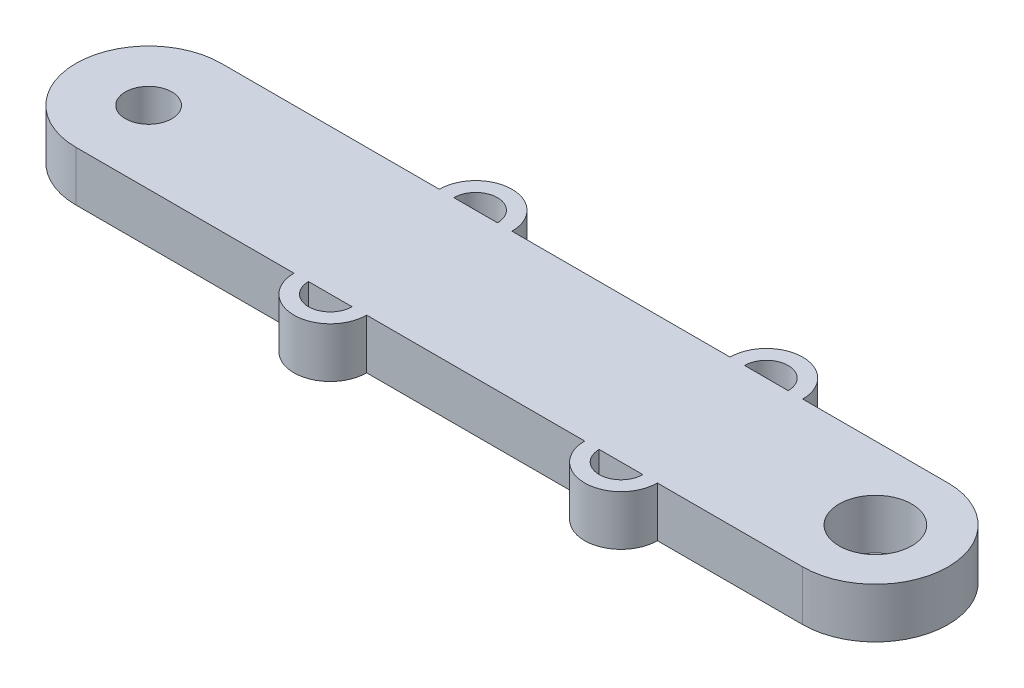
ISO-10303-21;
HEADER;
FILE_DESCRIPTION(('STEP AP214'),'2;1');
FILE_NAME('part.step','',(''),(''),'','','');
FILE_SCHEMA(('AUTOMOTIVE_DESIGN { 1 0 10303 214 1 1 1 1 }'));
ENDSEC;
DATA;
#1=APPLICATION_CONTEXT('core data for automotive mechanical design processes');
#2=APPLICATION_PROTOCOL_DEFINITION('international standard','automotive_design',2000,#1);
#3=PRODUCT_CONTEXT('',#1,'mechanical');
#4=PRODUCT('Part','Part','',(#3));
#5=PRODUCT_RELATED_PRODUCT_CATEGORY('part','',(#4));
#6=PRODUCT_DEFINITION_FORMATION('','',#4);
#7=PRODUCT_DEFINITION_CONTEXT('part definition',#1,'design');
#8=PRODUCT_DEFINITION('design','',#6,#7);
#9=PRODUCT_DEFINITION_SHAPE('','',#8);
#10=(LENGTH_UNIT() NAMED_UNIT(*) SI_UNIT(.MILLI.,.METRE.));
#11=(NAMED_UNIT(*) PLANE_ANGLE_UNIT() SI_UNIT($,.RADIAN.));
#12=(NAMED_UNIT(*) SI_UNIT($,.STERADIAN.) SOLID_ANGLE_UNIT());
#13=UNCERTAINTY_MEASURE_WITH_UNIT(LENGTH_MEASURE(1.E-05),#10,'distance_accuracy_value','');
#14=(GEOMETRIC_REPRESENTATION_CONTEXT(3) GLOBAL_UNCERTAINTY_ASSIGNED_CONTEXT((#13)) GLOBAL_UNIT_ASSIGNED_CONTEXT((#10,
#11,#12)) REPRESENTATION_CONTEXT('',''));
#15=CARTESIAN_POINT('',(0.,0.,0.));
#16=DIRECTION('',(0.,0.,1.));
#17=DIRECTION('',(1.,0.,0.));
#18=AXIS2_PLACEMENT_3D('',#15,#16,#17);
#19=CARTESIAN_POINT('',(0.,6.88,-10.));
#20=DIRECTION('',(0.,0.,-1.));
#21=DIRECTION('',(-1.,0.,0.));
#22=AXIS2_PLACEMENT_3D('',#19,#20,#21);
#23=PLANE('',#22);
#24=DIRECTION('',(1.,0.,0.));
#25=VECTOR('',#24,1.);
#26=CARTESIAN_POINT('',(0.,6.88,-10.));
#27=LINE('',#26,#25);
#28=CARTESIAN_POINT('',(22.,6.88,-10.));
#29=VERTEX_POINT('',#28);
#30=CARTESIAN_POINT('',(28.,6.88,-10.));
#31=VERTEX_POINT('',#30);
#32=EDGE_CURVE('E195',#29,#31,#27,.T.);
#33=ORIENTED_EDGE('',*,*,#32,.T.);
#34=DIRECTION('',(0.,-1.,0.));
#35=VECTOR('',#34,1.);
#36=CARTESIAN_POINT('',(28.,18.060339887499,-10.));
#37=LINE('',#36,#35);
#38=CARTESIAN_POINT('',(28.,0.,-10.));
#39=VERTEX_POINT('',#38);
#40=EDGE_CURVE('E188',#31,#39,#37,.T.);
#41=ORIENTED_EDGE('',*,*,#40,.T.);
#42=DIRECTION('',(1.,0.,0.));
#43=VECTOR('',#42,1.);
#44=CARTESIAN_POINT('',(0.,0.,-10.));
#45=LINE('',#44,#43);
#46=CARTESIAN_POINT('',(22.,0.,-10.));
#47=VERTEX_POINT('',#46);
#48=EDGE_CURVE('E432',#47,#39,#45,.T.);
#49=ORIENTED_EDGE('',*,*,#48,.F.);
#50=DIRECTION('',(0.,-1.,0.));
#51=VECTOR('',#50,1.);
#52=CARTESIAN_POINT('',(22.,18.060339887499,-10.));
#53=LINE('',#52,#51);
#54=EDGE_CURVE('E427',#29,#47,#53,.T.);
#55=ORIENTED_EDGE('',*,*,#54,.F.);
#56=EDGE_LOOP('',(#33,#41,#49,#55));
#57=FACE_BOUND('',#56,.T.);
#58=ADVANCED_FACE('F35',(#57),#23,.T.);
#59=DIRECTION('',(0.,-1.,0.));
#60=VECTOR('',#59,1.);
#61=CARTESIAN_POINT('',(30.,18.060339887499,-10.));
#62=LINE('',#61,#60);
#63=CARTESIAN_POINT('',(30.,6.88,-10.));
#64=VERTEX_POINT('',#63);
#65=CARTESIAN_POINT('',(30.,0.,-10.));
#66=VERTEX_POINT('',#65);
#67=EDGE_CURVE('E173',#64,#66,#62,.T.);
#68=ORIENTED_EDGE('',*,*,#67,.F.);
#69=CARTESIAN_POINT('',(50.,6.88,-10.));
#70=VERTEX_POINT('',#69);
#71=EDGE_CURVE('E185',#64,#70,#27,.T.);
#72=ORIENTED_EDGE('',*,*,#71,.T.);
#73=DIRECTION('',(0.,-1.,0.));
#74=VECTOR('',#73,1.);
#75=CARTESIAN_POINT('',(50.,6.88,-10.));
#76=LINE('',#75,#74);
#77=CARTESIAN_POINT('',(50.,0.,-10.));
#78=VERTEX_POINT('',#77);
#79=EDGE_CURVE('E209',#70,#78,#76,.T.);
#80=ORIENTED_EDGE('',*,*,#79,.T.);
#81=EDGE_CURVE('E187',#66,#78,#45,.T.);
#82=ORIENTED_EDGE('',*,*,#81,.F.);
#83=EDGE_LOOP('',(#68,#72,#80,#82));
#84=FACE_BOUND('',#83,.T.);
#85=ADVANCED_FACE('F183',(#84),#23,.T.);
#86=CARTESIAN_POINT('',(-18.,6.88,-9.99999999999999));
#87=VERTEX_POINT('',#86);
#88=CARTESIAN_POINT('',(-12.,6.88,-9.99999999999999));
#89=VERTEX_POINT('',#88);
#90=EDGE_CURVE('E205',#87,#89,#27,.T.);
#91=ORIENTED_EDGE('',*,*,#90,.T.);
#92=DIRECTION('',(0.,-1.,0.));
#93=VECTOR('',#92,1.);
#94=CARTESIAN_POINT('',(-12.,18.060339887499,-9.99999999999999));
#95=LINE('',#94,#93);
#96=CARTESIAN_POINT('',(-12.,0.,-9.99999999999999));
#97=VERTEX_POINT('',#96);
#98=EDGE_CURVE('E450',#89,#97,#95,.T.);
#99=ORIENTED_EDGE('',*,*,#98,.T.);
#100=CARTESIAN_POINT('',(-18.,0.,-10.));
#101=VERTEX_POINT('',#100);
#102=EDGE_CURVE('E330',#101,#97,#45,.T.);
#103=ORIENTED_EDGE('',*,*,#102,.F.);
#104=DIRECTION('',(0.,-1.,0.));
#105=VECTOR('',#104,1.);
#106=CARTESIAN_POINT('',(-18.,18.060339887499,-9.99999999999999));
#107=LINE('',#106,#105);
#108=EDGE_CURVE('E238',#87,#101,#107,.T.);
#109=ORIENTED_EDGE('',*,*,#108,.F.);
#110=EDGE_LOOP('',(#91,#99,#103,#109));
#111=FACE_BOUND('',#110,.T.);
#112=ADVANCED_FACE('F361',(#111),#23,.T.);
#113=DIRECTION('',(0.,-1.,0.));
#114=VECTOR('',#113,1.);
#115=CARTESIAN_POINT('',(20.,18.060339887499,-10.));
#116=LINE('',#115,#114);
#117=CARTESIAN_POINT('',(20.,6.88,-10.));
#118=VERTEX_POINT('',#117);
#119=CARTESIAN_POINT('',(20.,0.,-10.));
#120=VERTEX_POINT('',#119);
#121=EDGE_CURVE('E176',#118,#120,#116,.T.);
#122=ORIENTED_EDGE('',*,*,#121,.T.);
#123=CARTESIAN_POINT('',(-10.,0.,-10.));
#124=VERTEX_POINT('',#123);
#125=EDGE_CURVE('E460',#124,#120,#45,.T.);
#126=ORIENTED_EDGE('',*,*,#125,.F.);
#127=DIRECTION('',(0.,-1.,0.));
#128=VECTOR('',#127,1.);
#129=CARTESIAN_POINT('',(-10.,18.060339887499,-9.99999999999999));
#130=LINE('',#129,#128);
#131=CARTESIAN_POINT('',(-10.,6.88,-9.99999999999999));
#132=VERTEX_POINT('',#131);
#133=EDGE_CURVE('E221',#132,#124,#130,.T.);
#134=ORIENTED_EDGE('',*,*,#133,.F.);
#135=EDGE_CURVE('E199',#132,#118,#27,.T.);
#136=ORIENTED_EDGE('',*,*,#135,.T.);
#137=EDGE_LOOP('',(#122,#126,#134,#136));
#138=FACE_BOUND('',#137,.T.);
#139=ADVANCED_FACE('F218',(#138),#23,.T.);
#140=CARTESIAN_POINT('',(0.,6.88,10.));
#141=DIRECTION('',(0.,0.,-1.));
#142=DIRECTION('',(-1.,0.,0.));
#143=AXIS2_PLACEMENT_3D('',#140,#141,#142);
#144=PLANE('',#143);
#145=DIRECTION('',(0.,-1.,0.));
#146=VECTOR('',#145,1.);
#147=CARTESIAN_POINT('',(30.,18.060339887499,10.));
#148=LINE('',#147,#146);
#149=CARTESIAN_POINT('',(30.,6.88,10.));
#150=VERTEX_POINT('',#149);
#151=CARTESIAN_POINT('',(30.,0.,10.));
#152=VERTEX_POINT('',#151);
#153=EDGE_CURVE('E256',#150,#152,#148,.T.);
#154=ORIENTED_EDGE('',*,*,#153,.T.);
#155=DIRECTION('',(1.,0.,0.));
#156=VECTOR('',#155,1.);
#157=CARTESIAN_POINT('',(0.,0.,10.));
#158=LINE('',#157,#156);
#159=CARTESIAN_POINT('',(50.,0.,10.));
#160=VERTEX_POINT('',#159);
#161=EDGE_CURVE('E320',#152,#160,#158,.T.);
#162=ORIENTED_EDGE('',*,*,#161,.T.);
#163=DIRECTION('',(0.,-1.,0.));
#164=VECTOR('',#163,1.);
#165=CARTESIAN_POINT('',(50.,6.88,10.));
#166=LINE('',#165,#164);
#167=CARTESIAN_POINT('',(50.,6.88,10.));
#168=VERTEX_POINT('',#167);
#169=EDGE_CURVE('E43',#168,#160,#166,.T.);
#170=ORIENTED_EDGE('',*,*,#169,.F.);
#171=DIRECTION('',(1.,0.,0.));
#172=VECTOR('',#171,1.);
#173=CARTESIAN_POINT('',(0.,6.88,10.));
#174=LINE('',#173,#172);
#175=EDGE_CURVE('E298',#150,#168,#174,.T.);
#176=ORIENTED_EDGE('',*,*,#175,.F.);
#177=EDGE_LOOP('',(#154,#162,#170,#176));
#178=FACE_BOUND('',#177,.T.);
#179=ADVANCED_FACE('F319',(#178),#144,.F.);
#180=DIRECTION('',(0.,-1.,0.));
#181=VECTOR('',#180,1.);
#182=CARTESIAN_POINT('',(20.,18.060339887499,10.));
#183=LINE('',#182,#181);
#184=CARTESIAN_POINT('',(20.,6.88,10.));
#185=VERTEX_POINT('',#184);
#186=CARTESIAN_POINT('',(20.,0.,10.));
#187=VERTEX_POINT('',#186);
#188=EDGE_CURVE('E250',#185,#187,#183,.T.);
#189=ORIENTED_EDGE('',*,*,#188,.F.);
#190=CARTESIAN_POINT('',(-10.,6.88,10.));
#191=VERTEX_POINT('',#190);
#192=EDGE_CURVE('E304',#191,#185,#174,.T.);
#193=ORIENTED_EDGE('',*,*,#192,.F.);
#194=DIRECTION('',(0.,-1.,0.));
#195=VECTOR('',#194,1.);
#196=CARTESIAN_POINT('',(-10.,18.060339887499,9.99999999999999));
#197=LINE('',#196,#195);
#198=CARTESIAN_POINT('',(-10.,0.,9.99999999999999));
#199=VERTEX_POINT('',#198);
#200=EDGE_CURVE('E280',#191,#199,#197,.T.);
#201=ORIENTED_EDGE('',*,*,#200,.T.);
#202=EDGE_CURVE('E386',#199,#187,#158,.T.);
#203=ORIENTED_EDGE('',*,*,#202,.T.);
#204=EDGE_LOOP('',(#189,#193,#201,#203));
#205=FACE_BOUND('',#204,.T.);
#206=ADVANCED_FACE('F385',(#205),#144,.F.);
#207=CARTESIAN_POINT('',(22.,0.,10.));
#208=VERTEX_POINT('',#207);
#209=CARTESIAN_POINT('',(28.,0.,10.));
#210=VERTEX_POINT('',#209);
#211=EDGE_CURVE('E387',#208,#210,#158,.T.);
#212=ORIENTED_EDGE('',*,*,#211,.T.);
#213=DIRECTION('',(0.,-1.,0.));
#214=VECTOR('',#213,1.);
#215=CARTESIAN_POINT('',(28.,18.060339887499,10.));
#216=LINE('',#215,#214);
#217=CARTESIAN_POINT('',(28.,6.88,10.));
#218=VERTEX_POINT('',#217);
#219=EDGE_CURVE('E252',#218,#210,#216,.T.);
#220=ORIENTED_EDGE('',*,*,#219,.F.);
#221=CARTESIAN_POINT('',(22.,6.88,10.));
#222=VERTEX_POINT('',#221);
#223=EDGE_CURVE('E305',#222,#218,#174,.T.);
#224=ORIENTED_EDGE('',*,*,#223,.F.);
#225=DIRECTION('',(0.,-1.,0.));
#226=VECTOR('',#225,1.);
#227=CARTESIAN_POINT('',(22.,18.060339887499,10.));
#228=LINE('',#227,#226);
#229=EDGE_CURVE('E249',#222,#208,#228,.T.);
#230=ORIENTED_EDGE('',*,*,#229,.T.);
#231=EDGE_LOOP('',(#212,#220,#224,#230));
#232=FACE_BOUND('',#231,.T.);
#233=ADVANCED_FACE('F378',(#232),#144,.F.);
#234=DIRECTION('',(0.,-1.,0.));
#235=VECTOR('',#234,1.);
#236=CARTESIAN_POINT('',(-20.,18.060339887499,9.99999999999999));
#237=LINE('',#236,#235);
#238=CARTESIAN_POINT('',(-20.,6.88,10.));
#239=VERTEX_POINT('',#238);
#240=CARTESIAN_POINT('',(-20.,0.,10.));
#241=VERTEX_POINT('',#240);
#242=EDGE_CURVE('E272',#239,#241,#237,.T.);
#243=ORIENTED_EDGE('',*,*,#242,.F.);
#244=CARTESIAN_POINT('',(-50.,6.88,10.));
#245=VERTEX_POINT('',#244);
#246=EDGE_CURVE('E200',#245,#239,#174,.T.);
#247=ORIENTED_EDGE('',*,*,#246,.F.);
#248=DIRECTION('',(0.,-1.,0.));
#249=VECTOR('',#248,1.);
#250=CARTESIAN_POINT('',(-50.,6.88,10.));
#251=LINE('',#250,#249);
#252=CARTESIAN_POINT('',(-50.,0.,10.));
#253=VERTEX_POINT('',#252);
#254=EDGE_CURVE('E11',#245,#253,#251,.T.);
#255=ORIENTED_EDGE('',*,*,#254,.T.);
#256=EDGE_CURVE('E332',#253,#241,#158,.T.);
#257=ORIENTED_EDGE('',*,*,#256,.T.);
#258=EDGE_LOOP('',(#243,#247,#255,#257));
#259=FACE_BOUND('',#258,.T.);
#260=ADVANCED_FACE('F372',(#259),#144,.F.);
#261=CARTESIAN_POINT('',(-50.,6.88,0.));
#262=DIRECTION('',(0.,-1.,0.));
#263=DIRECTION('',(0.,0.,-1.));
#264=AXIS2_PLACEMENT_3D('',#261,#262,#263);
#265=CYLINDRICAL_SURFACE('',#264,10.);
#266=CARTESIAN_POINT('',(-50.,0.,0.));
#267=DIRECTION('',(0.,1.,0.));
#268=DIRECTION('',(0.,0.,1.));
#269=AXIS2_PLACEMENT_3D('',#266,#267,#268);
#270=CIRCLE('',#269,10.);
#271=CARTESIAN_POINT('',(-50.,0.,-10.));
#272=VERTEX_POINT('',#271);
#273=EDGE_CURVE('E335',#253,#272,#270,.F.);
#274=ORIENTED_EDGE('',*,*,#273,.F.);
#275=ORIENTED_EDGE('',*,*,#254,.F.);
#276=CARTESIAN_POINT('',(-50.,6.88,0.));
#277=DIRECTION('',(0.,1.,0.));
#278=DIRECTION('',(0.,0.,1.));
#279=AXIS2_PLACEMENT_3D('',#276,#277,#278);
#280=CIRCLE('',#279,10.);
#281=CARTESIAN_POINT('',(-50.,6.88,-10.));
#282=VERTEX_POINT('',#281);
#283=EDGE_CURVE('E295',#245,#282,#280,.F.);
#284=ORIENTED_EDGE('',*,*,#283,.T.);
#285=DIRECTION('',(0.,-1.,0.));
#286=VECTOR('',#285,1.);
#287=CARTESIAN_POINT('',(-50.,6.88,-10.));
#288=LINE('',#287,#286);
#289=EDGE_CURVE('E204',#282,#272,#288,.T.);
#290=ORIENTED_EDGE('',*,*,#289,.T.);
#291=EDGE_LOOP('',(#274,#275,#284,#290));
#292=FACE_BOUND('',#291,.T.);
#293=ADVANCED_FACE('F370',(#292),#265,.T.);
#294=CARTESIAN_POINT('',(-18.,0.,9.99999999999999));
#295=VERTEX_POINT('',#294);
#296=CARTESIAN_POINT('',(-12.,0.,10.));
#297=VERTEX_POINT('',#296);
#298=EDGE_CURVE('E334',#295,#297,#158,.T.);
#299=ORIENTED_EDGE('',*,*,#298,.T.);
#300=DIRECTION('',(0.,-1.,0.));
#301=VECTOR('',#300,1.);
#302=CARTESIAN_POINT('',(-12.,18.060339887499,9.99999999999999));
#303=LINE('',#302,#301);
#304=CARTESIAN_POINT('',(-12.,6.88,10.));
#305=VERTEX_POINT('',#304);
#306=EDGE_CURVE('E275',#305,#297,#303,.T.);
#307=ORIENTED_EDGE('',*,*,#306,.F.);
#308=CARTESIAN_POINT('',(-18.,6.88,10.));
#309=VERTEX_POINT('',#308);
#310=EDGE_CURVE('E300',#309,#305,#174,.T.);
#311=ORIENTED_EDGE('',*,*,#310,.F.);
#312=DIRECTION('',(0.,-1.,0.));
#313=VECTOR('',#312,1.);
#314=CARTESIAN_POINT('',(-18.,18.060339887499,9.99999999999999));
#315=LINE('',#314,#313);
#316=EDGE_CURVE('E271',#309,#295,#315,.T.);
#317=ORIENTED_EDGE('',*,*,#316,.T.);
#318=EDGE_LOOP('',(#299,#307,#311,#317));
#319=FACE_BOUND('',#318,.T.);
#320=ADVANCED_FACE('F367',(#319),#144,.F.);
#321=CARTESIAN_POINT('',(50.,6.88,0.));
#322=DIRECTION('',(0.,-1.,0.));
#323=DIRECTION('',(0.,0.,-1.));
#324=AXIS2_PLACEMENT_3D('',#321,#322,#323);
#325=CYLINDRICAL_SURFACE('',#324,10.);
#326=CARTESIAN_POINT('',(50.,0.,0.));
#327=DIRECTION('',(0.,1.,0.));
#328=DIRECTION('',(0.,0.,1.));
#329=AXIS2_PLACEMENT_3D('',#326,#327,#328);
#330=CIRCLE('',#329,10.);
#331=EDGE_CURVE('E326',#78,#160,#330,.F.);
#332=ORIENTED_EDGE('',*,*,#331,.F.);
#333=ORIENTED_EDGE('',*,*,#79,.F.);
#334=CARTESIAN_POINT('',(50.,6.88,0.));
#335=DIRECTION('',(0.,1.,0.));
#336=DIRECTION('',(0.,0.,1.));
#337=AXIS2_PLACEMENT_3D('',#334,#335,#336);
#338=CIRCLE('',#337,10.);
#339=EDGE_CURVE('E194',#70,#168,#338,.F.);
#340=ORIENTED_EDGE('',*,*,#339,.T.);
#341=ORIENTED_EDGE('',*,*,#169,.T.);
#342=EDGE_LOOP('',(#332,#333,#340,#341));
#343=FACE_BOUND('',#342,.T.);
#344=ADVANCED_FACE('F325',(#343),#325,.T.);
#345=CARTESIAN_POINT('',(-50.,6.88,0.));
#346=DIRECTION('',(0.,-1.,0.));
#347=DIRECTION('',(0.,0.,-1.));
#348=AXIS2_PLACEMENT_3D('',#345,#346,#347);
#349=CYLINDRICAL_SURFACE('',#348,3.2);
#350=CARTESIAN_POINT('',(-50.,6.88,0.));
#351=DIRECTION('',(0.,1.,0.));
#352=DIRECTION('',(0.,0.,1.));
#353=AXIS2_PLACEMENT_3D('',#350,#351,#352);
#354=CIRCLE('',#353,3.2);
#355=CARTESIAN_POINT('',(-50.,6.88,3.2));
#356=VERTEX_POINT('',#355);
#357=EDGE_CURVE('E291',#356,#356,#354,.T.);
#358=ORIENTED_EDGE('',*,*,#357,.T.);
#359=EDGE_LOOP('',(#358));
#360=FACE_BOUND('',#359,.T.);
#361=CARTESIAN_POINT('',(-50.,0.,0.));
#362=DIRECTION('',(0.,1.,0.));
#363=DIRECTION('',(0.,0.,1.));
#364=AXIS2_PLACEMENT_3D('',#361,#362,#363);
#365=CIRCLE('',#364,3.2);
#366=CARTESIAN_POINT('',(-50.,0.,3.2));
#367=VERTEX_POINT('',#366);
#368=EDGE_CURVE('E338',#367,#367,#365,.T.);
#369=ORIENTED_EDGE('',*,*,#368,.F.);
#370=EDGE_LOOP('',(#369));
#371=FACE_BOUND('',#370,.T.);
#372=ADVANCED_FACE('F348',(#360,#371),#349,.F.);
#373=CARTESIAN_POINT('',(50.,6.88,0.));
#374=DIRECTION('',(0.,-1.,0.));
#375=DIRECTION('',(0.,0.,-1.));
#376=AXIS2_PLACEMENT_3D('',#373,#374,#375);
#377=CYLINDRICAL_SURFACE('',#376,5.);
#378=CARTESIAN_POINT('',(50.,6.88,0.));
#379=DIRECTION('',(0.,1.,0.));
#380=DIRECTION('',(0.,0.,1.));
#381=AXIS2_PLACEMENT_3D('',#378,#379,#380);
#382=CIRCLE('',#381,5.);
#383=CARTESIAN_POINT('',(50.,6.88,5.));
#384=VERTEX_POINT('',#383);
#385=EDGE_CURVE('E288',#384,#384,#382,.T.);
#386=ORIENTED_EDGE('',*,*,#385,.T.);
#387=EDGE_LOOP('',(#386));
#388=FACE_BOUND('',#387,.T.);
#389=CARTESIAN_POINT('',(50.,0.,0.));
#390=DIRECTION('',(0.,1.,0.));
#391=DIRECTION('',(0.,0.,1.));
#392=AXIS2_PLACEMENT_3D('',#389,#390,#391);
#393=CIRCLE('',#392,5.);
#394=CARTESIAN_POINT('',(50.,0.,5.));
#395=VERTEX_POINT('',#394);
#396=EDGE_CURVE('E287',#395,#395,#393,.T.);
#397=ORIENTED_EDGE('',*,*,#396,.F.);
#398=EDGE_LOOP('',(#397));
#399=FACE_BOUND('',#398,.T.);
#400=ADVANCED_FACE('F37',(#388,#399),#377,.F.);
#401=DIRECTION('',(0.,-1.,0.));
#402=VECTOR('',#401,1.);
#403=CARTESIAN_POINT('',(-20.,18.060339887499,-9.99999999999999));
#404=LINE('',#403,#402);
#405=CARTESIAN_POINT('',(-20.,6.88,-9.99999999999999));
#406=VERTEX_POINT('',#405);
#407=CARTESIAN_POINT('',(-20.,0.,-9.99999999999999));
#408=VERTEX_POINT('',#407);
#409=EDGE_CURVE('E228',#406,#408,#404,.T.);
#410=ORIENTED_EDGE('',*,*,#409,.T.);
#411=EDGE_CURVE('E292',#272,#408,#45,.T.);
#412=ORIENTED_EDGE('',*,*,#411,.F.);
#413=ORIENTED_EDGE('',*,*,#289,.F.);
#414=EDGE_CURVE('E197',#282,#406,#27,.T.);
#415=ORIENTED_EDGE('',*,*,#414,.T.);
#416=EDGE_LOOP('',(#410,#412,#413,#415));
#417=FACE_BOUND('',#416,.T.);
#418=ADVANCED_FACE('F347',(#417),#23,.T.);
#419=CARTESIAN_POINT('',(0.,6.88,0.));
#420=DIRECTION('',(0.,1.,0.));
#421=DIRECTION('',(0.,0.,1.));
#422=AXIS2_PLACEMENT_3D('',#419,#420,#421);
#423=PLANE('',#422);
#424=ORIENTED_EDGE('',*,*,#71,.F.);
#425=CARTESIAN_POINT('',(25.,6.88,-10.));
#426=DIRECTION('',(0.,1.,0.));
#427=DIRECTION('',(0.,0.,1.));
#428=AXIS2_PLACEMENT_3D('',#425,#426,#427);
#429=CIRCLE('',#428,5.);
#430=EDGE_CURVE('E170',#118,#64,#429,.F.);
#431=ORIENTED_EDGE('',*,*,#430,.F.);
#432=ORIENTED_EDGE('',*,*,#135,.F.);
#433=CARTESIAN_POINT('',(-15.,6.88,-9.99999999999999));
#434=DIRECTION('',(0.,1.,0.));
#435=DIRECTION('',(0.,0.,1.));
#436=AXIS2_PLACEMENT_3D('',#433,#434,#435);
#437=CIRCLE('',#436,5.);
#438=EDGE_CURVE('E222',#406,#132,#437,.F.);
#439=ORIENTED_EDGE('',*,*,#438,.F.);
#440=ORIENTED_EDGE('',*,*,#414,.F.);
#441=ORIENTED_EDGE('',*,*,#283,.F.);
#442=ORIENTED_EDGE('',*,*,#246,.T.);
#443=CARTESIAN_POINT('',(-15.,6.88,9.99999999999999));
#444=DIRECTION('',(0.,1.,0.));
#445=DIRECTION('',(0.,0.,1.));
#446=AXIS2_PLACEMENT_3D('',#443,#444,#445);
#447=CIRCLE('',#446,5.);
#448=EDGE_CURVE('E263',#239,#191,#447,.T.);
#449=ORIENTED_EDGE('',*,*,#448,.T.);
#450=ORIENTED_EDGE('',*,*,#192,.T.);
#451=CARTESIAN_POINT('',(25.,6.88,10.));
#452=DIRECTION('',(0.,1.,0.));
#453=DIRECTION('',(0.,0.,1.));
#454=AXIS2_PLACEMENT_3D('',#451,#452,#453);
#455=CIRCLE('',#454,5.);
#456=EDGE_CURVE('E232',#185,#150,#455,.T.);
#457=ORIENTED_EDGE('',*,*,#456,.T.);
#458=ORIENTED_EDGE('',*,*,#175,.T.);
#459=ORIENTED_EDGE('',*,*,#339,.F.);
#460=EDGE_LOOP('',(#424,#431,#432,#439,#440,#441,#442,#449,#450,#457,#458,#459));
#461=FACE_BOUND('',#460,.T.);
#462=CARTESIAN_POINT('',(25.,6.88,-10.));
#463=DIRECTION('',(0.,1.,0.));
#464=DIRECTION('',(0.,0.,1.));
#465=AXIS2_PLACEMENT_3D('',#462,#463,#464);
#466=CIRCLE('',#465,3.);
#467=EDGE_CURVE('E425',#29,#31,#466,.F.);
#468=ORIENTED_EDGE('',*,*,#467,.T.);
#469=ORIENTED_EDGE('',*,*,#32,.F.);
#470=EDGE_LOOP('',(#468,#469));
#471=FACE_BOUND('',#470,.T.);
#472=CARTESIAN_POINT('',(-15.,6.88,-9.99999999999999));
#473=DIRECTION('',(0.,1.,0.));
#474=DIRECTION('',(0.,0.,1.));
#475=AXIS2_PLACEMENT_3D('',#472,#473,#474);
#476=CIRCLE('',#475,3.);
#477=EDGE_CURVE('E435',#87,#89,#476,.F.);
#478=ORIENTED_EDGE('',*,*,#477,.T.);
#479=ORIENTED_EDGE('',*,*,#90,.F.);
#480=EDGE_LOOP('',(#478,#479));
#481=FACE_BOUND('',#480,.T.);
#482=ORIENTED_EDGE('',*,*,#223,.T.);
#483=CARTESIAN_POINT('',(25.,6.88,10.));
#484=DIRECTION('',(0.,1.,0.));
#485=DIRECTION('',(0.,0.,1.));
#486=AXIS2_PLACEMENT_3D('',#483,#484,#485);
#487=CIRCLE('',#486,3.);
#488=EDGE_CURVE('E245',#222,#218,#487,.T.);
#489=ORIENTED_EDGE('',*,*,#488,.F.);
#490=EDGE_LOOP('',(#482,#489));
#491=FACE_BOUND('',#490,.T.);
#492=ORIENTED_EDGE('',*,*,#385,.F.);
#493=EDGE_LOOP('',(#492));
#494=FACE_BOUND('',#493,.T.);
#495=ORIENTED_EDGE('',*,*,#357,.F.);
#496=EDGE_LOOP('',(#495));
#497=FACE_BOUND('',#496,.T.);
#498=ORIENTED_EDGE('',*,*,#310,.T.);
#499=CARTESIAN_POINT('',(-15.,6.88,9.99999999999999));
#500=DIRECTION('',(0.,1.,0.));
#501=DIRECTION('',(0.,0.,1.));
#502=AXIS2_PLACEMENT_3D('',#499,#500,#501);
#503=CIRCLE('',#502,3.);
#504=EDGE_CURVE('E267',#309,#305,#503,.T.);
#505=ORIENTED_EDGE('',*,*,#504,.F.);
#506=EDGE_LOOP('',(#498,#505));
#507=FACE_BOUND('',#506,.T.);
#508=ADVANCED_FACE('F191',(#461,#471,#481,#491,#494,#497,#507),#423,.T.);
#509=CARTESIAN_POINT('',(0.,0.,0.));
#510=DIRECTION('',(0.,1.,0.));
#511=DIRECTION('',(0.,0.,1.));
#512=AXIS2_PLACEMENT_3D('',#509,#510,#511);
#513=PLANE('',#512);
#514=CARTESIAN_POINT('',(25.,0.,-10.));
#515=DIRECTION('',(0.,-1.,0.));
#516=DIRECTION('',(0.,0.,-1.));
#517=AXIS2_PLACEMENT_3D('',#514,#515,#516);
#518=CIRCLE('',#517,5.);
#519=EDGE_CURVE('E50',#120,#66,#518,.T.);
#520=ORIENTED_EDGE('',*,*,#519,.T.);
#521=ORIENTED_EDGE('',*,*,#81,.T.);
#522=ORIENTED_EDGE('',*,*,#331,.T.);
#523=ORIENTED_EDGE('',*,*,#161,.F.);
#524=CARTESIAN_POINT('',(25.,0.,10.));
#525=DIRECTION('',(0.,1.,0.));
#526=DIRECTION('',(0.,0.,1.));
#527=AXIS2_PLACEMENT_3D('',#524,#525,#526);
#528=CIRCLE('',#527,5.);
#529=EDGE_CURVE('E246',#187,#152,#528,.T.);
#530=ORIENTED_EDGE('',*,*,#529,.F.);
#531=ORIENTED_EDGE('',*,*,#202,.F.);
#532=CARTESIAN_POINT('',(-15.,0.,9.99999999999999));
#533=DIRECTION('',(0.,1.,0.));
#534=DIRECTION('',(0.,0.,1.));
#535=AXIS2_PLACEMENT_3D('',#532,#533,#534);
#536=CIRCLE('',#535,5.);
#537=EDGE_CURVE('E268',#241,#199,#536,.T.);
#538=ORIENTED_EDGE('',*,*,#537,.F.);
#539=ORIENTED_EDGE('',*,*,#256,.F.);
#540=ORIENTED_EDGE('',*,*,#273,.T.);
#541=ORIENTED_EDGE('',*,*,#411,.T.);
#542=CARTESIAN_POINT('',(-15.,0.,-9.99999999999999));
#543=DIRECTION('',(0.,-1.,0.));
#544=DIRECTION('',(0.,0.,-1.));
#545=AXIS2_PLACEMENT_3D('',#542,#543,#544);
#546=CIRCLE('',#545,5.);
#547=EDGE_CURVE('E226',#408,#124,#546,.T.);
#548=ORIENTED_EDGE('',*,*,#547,.T.);
#549=ORIENTED_EDGE('',*,*,#125,.T.);
#550=EDGE_LOOP('',(#520,#521,#522,#523,#530,#531,#538,#539,#540,#541,#548,#549));
#551=FACE_BOUND('',#550,.T.);
#552=ORIENTED_EDGE('',*,*,#48,.T.);
#553=CARTESIAN_POINT('',(25.,0.,-10.));
#554=DIRECTION('',(0.,-1.,0.));
#555=DIRECTION('',(0.,0.,-1.));
#556=AXIS2_PLACEMENT_3D('',#553,#554,#555);
#557=CIRCLE('',#556,3.);
#558=EDGE_CURVE('E57',#47,#39,#557,.T.);
#559=ORIENTED_EDGE('',*,*,#558,.F.);
#560=EDGE_LOOP('',(#552,#559));
#561=FACE_BOUND('',#560,.T.);
#562=ORIENTED_EDGE('',*,*,#102,.T.);
#563=CARTESIAN_POINT('',(-15.,0.,-9.99999999999999));
#564=DIRECTION('',(0.,-1.,0.));
#565=DIRECTION('',(0.,0.,-1.));
#566=AXIS2_PLACEMENT_3D('',#563,#564,#565);
#567=CIRCLE('',#566,3.);
#568=EDGE_CURVE('E233',#101,#97,#567,.T.);
#569=ORIENTED_EDGE('',*,*,#568,.F.);
#570=EDGE_LOOP('',(#562,#569));
#571=FACE_BOUND('',#570,.T.);
#572=CARTESIAN_POINT('',(25.,0.,10.));
#573=DIRECTION('',(0.,1.,0.));
#574=DIRECTION('',(0.,0.,1.));
#575=AXIS2_PLACEMENT_3D('',#572,#573,#574);
#576=CIRCLE('',#575,3.);
#577=EDGE_CURVE('E236',#208,#210,#576,.T.);
#578=ORIENTED_EDGE('',*,*,#577,.T.);
#579=ORIENTED_EDGE('',*,*,#211,.F.);
#580=EDGE_LOOP('',(#578,#579));
#581=FACE_BOUND('',#580,.T.);
#582=ORIENTED_EDGE('',*,*,#396,.T.);
#583=EDGE_LOOP('',(#582));
#584=FACE_BOUND('',#583,.T.);
#585=ORIENTED_EDGE('',*,*,#368,.T.);
#586=EDGE_LOOP('',(#585));
#587=FACE_BOUND('',#586,.T.);
#588=CARTESIAN_POINT('',(-15.,0.,9.99999999999999));
#589=DIRECTION('',(0.,1.,0.));
#590=DIRECTION('',(0.,0.,1.));
#591=AXIS2_PLACEMENT_3D('',#588,#589,#590);
#592=CIRCLE('',#591,3.);
#593=EDGE_CURVE('E264',#295,#297,#592,.T.);
#594=ORIENTED_EDGE('',*,*,#593,.T.);
#595=ORIENTED_EDGE('',*,*,#298,.F.);
#596=EDGE_LOOP('',(#594,#595));
#597=FACE_BOUND('',#596,.T.);
#598=ADVANCED_FACE('F343',(#551,#561,#571,#581,#584,#587,#597),#513,.F.);
#599=CARTESIAN_POINT('',(-15.,18.060339887499,9.99999999999999));
#600=DIRECTION('',(0.,-1.,0.));
#601=DIRECTION('',(0.,0.,-1.));
#602=AXIS2_PLACEMENT_3D('',#599,#600,#601);
#603=CYLINDRICAL_SURFACE('',#602,3.);
#604=ORIENTED_EDGE('',*,*,#316,.F.);
#605=ORIENTED_EDGE('',*,*,#504,.T.);
#606=ORIENTED_EDGE('',*,*,#306,.T.);
#607=ORIENTED_EDGE('',*,*,#593,.F.);
#608=EDGE_LOOP('',(#604,#605,#606,#607));
#609=FACE_BOUND('',#608,.T.);
#610=ADVANCED_FACE('F395',(#609),#603,.F.);
#611=CARTESIAN_POINT('',(-15.,18.060339887499,9.99999999999999));
#612=DIRECTION('',(0.,-1.,0.));
#613=DIRECTION('',(0.,0.,-1.));
#614=AXIS2_PLACEMENT_3D('',#611,#612,#613);
#615=CYLINDRICAL_SURFACE('',#614,5.);
#616=ORIENTED_EDGE('',*,*,#448,.F.);
#617=ORIENTED_EDGE('',*,*,#242,.T.);
#618=ORIENTED_EDGE('',*,*,#537,.T.);
#619=ORIENTED_EDGE('',*,*,#200,.F.);
#620=EDGE_LOOP('',(#616,#617,#618,#619));
#621=FACE_BOUND('',#620,.T.);
#622=ADVANCED_FACE('F384',(#621),#615,.T.);
#623=CARTESIAN_POINT('',(25.,18.060339887499,10.));
#624=DIRECTION('',(0.,-1.,0.));
#625=DIRECTION('',(0.,0.,-1.));
#626=AXIS2_PLACEMENT_3D('',#623,#624,#625);
#627=CYLINDRICAL_SURFACE('',#626,3.);
#628=ORIENTED_EDGE('',*,*,#229,.F.);
#629=ORIENTED_EDGE('',*,*,#488,.T.);
#630=ORIENTED_EDGE('',*,*,#219,.T.);
#631=ORIENTED_EDGE('',*,*,#577,.F.);
#632=EDGE_LOOP('',(#628,#629,#630,#631));
#633=FACE_BOUND('',#632,.T.);
#634=ADVANCED_FACE('F393',(#633),#627,.F.);
#635=CARTESIAN_POINT('',(25.,18.060339887499,10.));
#636=DIRECTION('',(0.,-1.,0.));
#637=DIRECTION('',(0.,0.,-1.));
#638=AXIS2_PLACEMENT_3D('',#635,#636,#637);
#639=CYLINDRICAL_SURFACE('',#638,5.);
#640=ORIENTED_EDGE('',*,*,#456,.F.);
#641=ORIENTED_EDGE('',*,*,#188,.T.);
#642=ORIENTED_EDGE('',*,*,#529,.T.);
#643=ORIENTED_EDGE('',*,*,#153,.F.);
#644=EDGE_LOOP('',(#640,#641,#642,#643));
#645=FACE_BOUND('',#644,.T.);
#646=ADVANCED_FACE('F316',(#645),#639,.T.);
#647=CARTESIAN_POINT('',(-15.,18.060339887499,-9.99999999999999));
#648=DIRECTION('',(0.,-1.,0.));
#649=DIRECTION('',(0.,0.,-1.));
#650=AXIS2_PLACEMENT_3D('',#647,#648,#649);
#651=CYLINDRICAL_SURFACE('',#650,5.);
#652=ORIENTED_EDGE('',*,*,#409,.F.);
#653=ORIENTED_EDGE('',*,*,#438,.T.);
#654=ORIENTED_EDGE('',*,*,#133,.T.);
#655=ORIENTED_EDGE('',*,*,#547,.F.);
#656=EDGE_LOOP('',(#652,#653,#654,#655));
#657=FACE_BOUND('',#656,.T.);
#658=ADVANCED_FACE('F229',(#657),#651,.T.);
#659=CARTESIAN_POINT('',(-15.,18.060339887499,-9.99999999999999));
#660=DIRECTION('',(0.,-1.,0.));
#661=DIRECTION('',(0.,0.,-1.));
#662=AXIS2_PLACEMENT_3D('',#659,#660,#661);
#663=CYLINDRICAL_SURFACE('',#662,3.);
#664=ORIENTED_EDGE('',*,*,#477,.F.);
#665=ORIENTED_EDGE('',*,*,#108,.T.);
#666=ORIENTED_EDGE('',*,*,#568,.T.);
#667=ORIENTED_EDGE('',*,*,#98,.F.);
#668=EDGE_LOOP('',(#664,#665,#666,#667));
#669=FACE_BOUND('',#668,.T.);
#670=ADVANCED_FACE('F413',(#669),#663,.F.);
#671=CARTESIAN_POINT('',(25.,18.060339887499,-10.));
#672=DIRECTION('',(0.,-1.,0.));
#673=DIRECTION('',(0.,0.,-1.));
#674=AXIS2_PLACEMENT_3D('',#671,#672,#673);
#675=CYLINDRICAL_SURFACE('',#674,5.);
#676=ORIENTED_EDGE('',*,*,#121,.F.);
#677=ORIENTED_EDGE('',*,*,#430,.T.);
#678=ORIENTED_EDGE('',*,*,#67,.T.);
#679=ORIENTED_EDGE('',*,*,#519,.F.);
#680=EDGE_LOOP('',(#676,#677,#678,#679));
#681=FACE_BOUND('',#680,.T.);
#682=ADVANCED_FACE('F172',(#681),#675,.T.);
#683=CARTESIAN_POINT('',(25.,18.060339887499,-10.));
#684=DIRECTION('',(0.,-1.,0.));
#685=DIRECTION('',(0.,0.,-1.));
#686=AXIS2_PLACEMENT_3D('',#683,#684,#685);
#687=CYLINDRICAL_SURFACE('',#686,3.);
#688=ORIENTED_EDGE('',*,*,#467,.F.);
#689=ORIENTED_EDGE('',*,*,#54,.T.);
#690=ORIENTED_EDGE('',*,*,#558,.T.);
#691=ORIENTED_EDGE('',*,*,#40,.F.);
#692=EDGE_LOOP('',(#688,#689,#690,#691));
#693=FACE_BOUND('',#692,.T.);
#694=ADVANCED_FACE('F419',(#693),#687,.F.);
#695=CLOSED_SHELL('',(#58,#85,#112,#139,#179,#206,#233,#260,#293,#320,#344,#372,#400,#418,#508,
#598,#610,#622,#634,#646,#658,#670,#682,#694));
#696=MANIFOLD_SOLID_BREP('B2',#695);
#697=ADVANCED_BREP_SHAPE_REPRESENTATION('',(#18,#696),#14);
#698=SHAPE_DEFINITION_REPRESENTATION(#9,#697);
ENDSEC;
END-ISO-10303-21;
